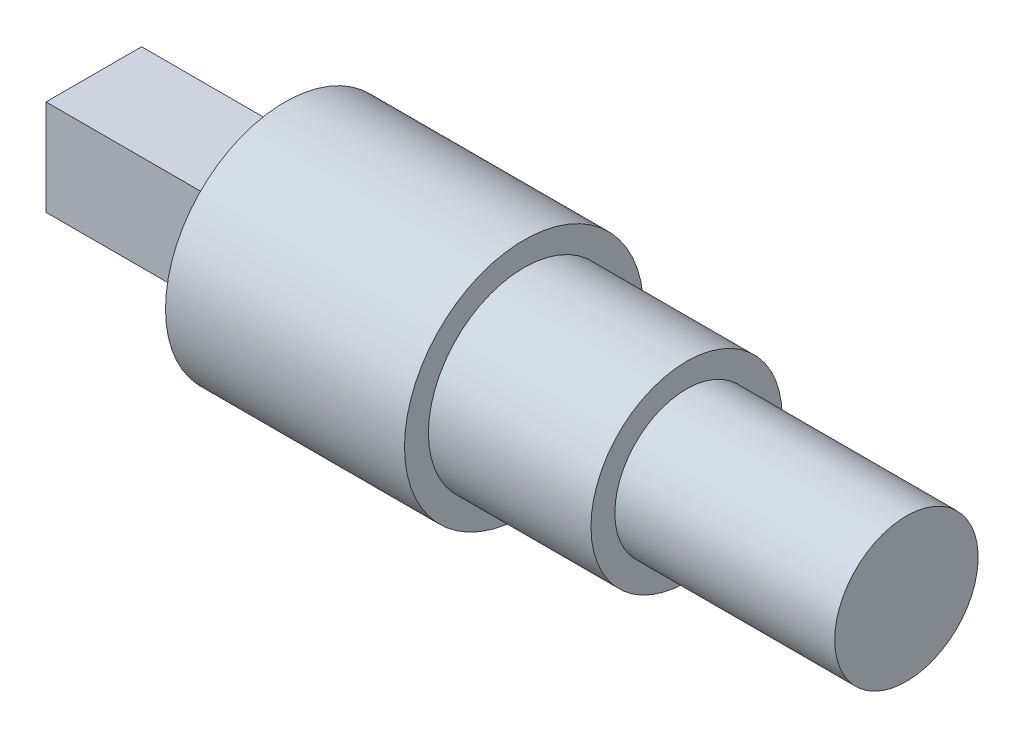
ISO-10303-21;
HEADER;
FILE_DESCRIPTION(('STEP AP214'),'2;1');
FILE_NAME('part.step','',(''),(''),'','','');
FILE_SCHEMA(('AUTOMOTIVE_DESIGN { 1 0 10303 214 1 1 1 1 }'));
ENDSEC;
DATA;
#1=APPLICATION_CONTEXT('core data for automotive mechanical design processes');
#2=APPLICATION_PROTOCOL_DEFINITION('international standard','automotive_design',2000,#1);
#3=PRODUCT_CONTEXT('',#1,'mechanical');
#4=PRODUCT('Part','Part','',(#3));
#5=PRODUCT_RELATED_PRODUCT_CATEGORY('part','',(#4));
#6=PRODUCT_DEFINITION_FORMATION('','',#4);
#7=PRODUCT_DEFINITION_CONTEXT('part definition',#1,'design');
#8=PRODUCT_DEFINITION('design','',#6,#7);
#9=PRODUCT_DEFINITION_SHAPE('','',#8);
#10=(LENGTH_UNIT() NAMED_UNIT(*) SI_UNIT(.MILLI.,.METRE.));
#11=(NAMED_UNIT(*) PLANE_ANGLE_UNIT() SI_UNIT($,.RADIAN.));
#12=(NAMED_UNIT(*) SI_UNIT($,.STERADIAN.) SOLID_ANGLE_UNIT());
#13=UNCERTAINTY_MEASURE_WITH_UNIT(LENGTH_MEASURE(1.E-05),#10,'distance_accuracy_value','');
#14=(GEOMETRIC_REPRESENTATION_CONTEXT(3) GLOBAL_UNCERTAINTY_ASSIGNED_CONTEXT((#13)) GLOBAL_UNIT_ASSIGNED_CONTEXT((#10,
#11,#12)) REPRESENTATION_CONTEXT('',''));
#15=CARTESIAN_POINT('',(0.,0.,0.));
#16=DIRECTION('',(0.,0.,1.));
#17=DIRECTION('',(1.,0.,0.));
#18=AXIS2_PLACEMENT_3D('',#15,#16,#17);
#19=CARTESIAN_POINT('',(20.,5.,0.));
#20=DIRECTION('',(1.,0.,0.));
#21=DIRECTION('',(0.,0.,-1.));
#22=AXIS2_PLACEMENT_3D('',#19,#20,#21);
#23=PLANE('',#22);
#24=DIRECTION('',(0.,0.,-1.));
#25=VECTOR('',#24,1.);
#26=CARTESIAN_POINT('',(20.,-5.,0.));
#27=LINE('',#26,#25);
#28=CARTESIAN_POINT('',(20.,-5.,5.));
#29=VERTEX_POINT('',#28);
#30=CARTESIAN_POINT('',(20.,-5.,-5.));
#31=VERTEX_POINT('',#30);
#32=EDGE_CURVE('E124',#29,#31,#27,.T.);
#33=ORIENTED_EDGE('',*,*,#32,.T.);
#34=DIRECTION('',(0.,1.,0.));
#35=VECTOR('',#34,1.);
#36=CARTESIAN_POINT('',(20.,5.,-5.));
#37=LINE('',#36,#35);
#38=CARTESIAN_POINT('',(20.,5.,-5.));
#39=VERTEX_POINT('',#38);
#40=EDGE_CURVE('E11',#31,#39,#37,.T.);
#41=ORIENTED_EDGE('',*,*,#40,.T.);
#42=DIRECTION('',(0.,0.,1.));
#43=VECTOR('',#42,1.);
#44=CARTESIAN_POINT('',(20.,5.,0.));
#45=LINE('',#44,#43);
#46=CARTESIAN_POINT('',(20.,5.,5.));
#47=VERTEX_POINT('',#46);
#48=EDGE_CURVE('E45',#39,#47,#45,.T.);
#49=ORIENTED_EDGE('',*,*,#48,.T.);
#50=DIRECTION('',(0.,-1.,0.));
#51=VECTOR('',#50,1.);
#52=CARTESIAN_POINT('',(20.,5.,5.));
#53=LINE('',#52,#51);
#54=EDGE_CURVE('E52',#47,#29,#53,.T.);
#55=ORIENTED_EDGE('',*,*,#54,.T.);
#56=EDGE_LOOP('',(#33,#41,#49,#55));
#57=FACE_BOUND('',#56,.T.);
#58=CARTESIAN_POINT('',(20.,0.,0.));
#59=DIRECTION('',(-1.,0.,0.));
#60=DIRECTION('',(0.,0.,1.));
#61=AXIS2_PLACEMENT_3D('',#58,#59,#60);
#62=CIRCLE('',#61,12.5);
#63=CARTESIAN_POINT('',(20.,0.,12.5));
#64=VERTEX_POINT('',#63);
#65=EDGE_CURVE('E120',#64,#64,#62,.T.);
#66=ORIENTED_EDGE('',*,*,#65,.T.);
#67=EDGE_LOOP('',(#66));
#68=FACE_BOUND('',#67,.T.);
#69=ADVANCED_FACE('F37',(#57,#68),#23,.F.);
#70=CARTESIAN_POINT('',(0.,0.,0.));
#71=DIRECTION('',(-1.,0.,0.));
#72=DIRECTION('',(0.,0.,1.));
#73=AXIS2_PLACEMENT_3D('',#70,#71,#72);
#74=CYLINDRICAL_SURFACE('',#73,12.5);
#75=ORIENTED_EDGE('',*,*,#65,.F.);
#76=EDGE_LOOP('',(#75));
#77=FACE_BOUND('',#76,.T.);
#78=CARTESIAN_POINT('',(45.,0.,0.));
#79=DIRECTION('',(-1.,0.,0.));
#80=DIRECTION('',(0.,0.,1.));
#81=AXIS2_PLACEMENT_3D('',#78,#79,#80);
#82=CIRCLE('',#81,12.5);
#83=CARTESIAN_POINT('',(45.,0.,12.5));
#84=VERTEX_POINT('',#83);
#85=EDGE_CURVE('E117',#84,#84,#82,.T.);
#86=ORIENTED_EDGE('',*,*,#85,.T.);
#87=EDGE_LOOP('',(#86));
#88=FACE_BOUND('',#87,.T.);
#89=ADVANCED_FACE('F127',(#77,#88),#74,.T.);
#90=CARTESIAN_POINT('',(45.,12.5,0.));
#91=DIRECTION('',(-1.,0.,0.));
#92=DIRECTION('',(0.,0.,1.));
#93=AXIS2_PLACEMENT_3D('',#90,#91,#92);
#94=PLANE('',#93);
#95=ORIENTED_EDGE('',*,*,#85,.F.);
#96=EDGE_LOOP('',(#95));
#97=FACE_BOUND('',#96,.T.);
#98=CARTESIAN_POINT('',(45.,0.,0.));
#99=DIRECTION('',(-1.,0.,0.));
#100=DIRECTION('',(0.,0.,1.));
#101=AXIS2_PLACEMENT_3D('',#98,#99,#100);
#102=CIRCLE('',#101,10.);
#103=CARTESIAN_POINT('',(45.,0.,10.));
#104=VERTEX_POINT('',#103);
#105=EDGE_CURVE('E114',#104,#104,#102,.T.);
#106=ORIENTED_EDGE('',*,*,#105,.T.);
#107=EDGE_LOOP('',(#106));
#108=FACE_BOUND('',#107,.T.);
#109=ADVANCED_FACE('F132',(#97,#108),#94,.F.);
#110=CARTESIAN_POINT('',(0.,0.,0.));
#111=DIRECTION('',(-1.,0.,0.));
#112=DIRECTION('',(0.,0.,1.));
#113=AXIS2_PLACEMENT_3D('',#110,#111,#112);
#114=CYLINDRICAL_SURFACE('',#113,10.);
#115=ORIENTED_EDGE('',*,*,#105,.F.);
#116=EDGE_LOOP('',(#115));
#117=FACE_BOUND('',#116,.T.);
#118=CARTESIAN_POINT('',(62.,0.,0.));
#119=DIRECTION('',(-1.,0.,0.));
#120=DIRECTION('',(0.,0.,1.));
#121=AXIS2_PLACEMENT_3D('',#118,#119,#120);
#122=CIRCLE('',#121,10.);
#123=CARTESIAN_POINT('',(62.,0.,10.));
#124=VERTEX_POINT('',#123);
#125=EDGE_CURVE('E111',#124,#124,#122,.T.);
#126=ORIENTED_EDGE('',*,*,#125,.T.);
#127=EDGE_LOOP('',(#126));
#128=FACE_BOUND('',#127,.T.);
#129=ADVANCED_FACE('F138',(#117,#128),#114,.T.);
#130=CARTESIAN_POINT('',(62.,10.,0.));
#131=DIRECTION('',(-1.,0.,0.));
#132=DIRECTION('',(0.,0.,1.));
#133=AXIS2_PLACEMENT_3D('',#130,#131,#132);
#134=PLANE('',#133);
#135=ORIENTED_EDGE('',*,*,#125,.F.);
#136=EDGE_LOOP('',(#135));
#137=FACE_BOUND('',#136,.T.);
#138=CARTESIAN_POINT('',(62.,0.,0.));
#139=DIRECTION('',(-1.,0.,0.));
#140=DIRECTION('',(0.,0.,1.));
#141=AXIS2_PLACEMENT_3D('',#138,#139,#140);
#142=CIRCLE('',#141,7.5);
#143=CARTESIAN_POINT('',(62.,0.,7.5));
#144=VERTEX_POINT('',#143);
#145=EDGE_CURVE('E108',#144,#144,#142,.T.);
#146=ORIENTED_EDGE('',*,*,#145,.T.);
#147=EDGE_LOOP('',(#146));
#148=FACE_BOUND('',#147,.T.);
#149=ADVANCED_FACE('F144',(#137,#148),#134,.F.);
#150=CARTESIAN_POINT('',(0.,0.,0.));
#151=DIRECTION('',(-1.,0.,0.));
#152=DIRECTION('',(0.,0.,1.));
#153=AXIS2_PLACEMENT_3D('',#150,#151,#152);
#154=CYLINDRICAL_SURFACE('',#153,7.5);
#155=ORIENTED_EDGE('',*,*,#145,.F.);
#156=EDGE_LOOP('',(#155));
#157=FACE_BOUND('',#156,.T.);
#158=CARTESIAN_POINT('',(85.,0.,0.));
#159=DIRECTION('',(-1.,0.,0.));
#160=DIRECTION('',(0.,0.,1.));
#161=AXIS2_PLACEMENT_3D('',#158,#159,#160);
#162=CIRCLE('',#161,7.5);
#163=CARTESIAN_POINT('',(85.,0.,7.5));
#164=VERTEX_POINT('',#163);
#165=EDGE_CURVE('E105',#164,#164,#162,.T.);
#166=ORIENTED_EDGE('',*,*,#165,.T.);
#167=EDGE_LOOP('',(#166));
#168=FACE_BOUND('',#167,.T.);
#169=ADVANCED_FACE('F150',(#157,#168),#154,.T.);
#170=CARTESIAN_POINT('',(85.,7.5,0.));
#171=DIRECTION('',(-1.,0.,0.));
#172=DIRECTION('',(0.,0.,1.));
#173=AXIS2_PLACEMENT_3D('',#170,#171,#172);
#174=PLANE('',#173);
#175=ORIENTED_EDGE('',*,*,#165,.F.);
#176=EDGE_LOOP('',(#175));
#177=FACE_BOUND('',#176,.T.);
#178=ADVANCED_FACE('F156',(#177),#174,.F.);
#179=CARTESIAN_POINT('',(34.142135623731,5.,-5.));
#180=DIRECTION('',(0.,1.,0.));
#181=DIRECTION('',(0.,0.,1.));
#182=AXIS2_PLACEMENT_3D('',#179,#180,#181);
#183=PLANE('',#182);
#184=DIRECTION('',(0.,0.,-1.));
#185=VECTOR('',#184,1.);
#186=CARTESIAN_POINT('',(0.,5.,-5.));
#187=LINE('',#186,#185);
#188=CARTESIAN_POINT('',(0.,5.,5.));
#189=VERTEX_POINT('',#188);
#190=CARTESIAN_POINT('',(0.,5.,-5.));
#191=VERTEX_POINT('',#190);
#192=EDGE_CURVE('E61',#189,#191,#187,.T.);
#193=ORIENTED_EDGE('',*,*,#192,.F.);
#194=DIRECTION('',(-1.,0.,0.));
#195=VECTOR('',#194,1.);
#196=CARTESIAN_POINT('',(34.142135623731,5.,5.));
#197=LINE('',#196,#195);
#198=EDGE_CURVE('E98',#47,#189,#197,.T.);
#199=ORIENTED_EDGE('',*,*,#198,.F.);
#200=ORIENTED_EDGE('',*,*,#48,.F.);
#201=DIRECTION('',(-1.,0.,0.));
#202=VECTOR('',#201,1.);
#203=CARTESIAN_POINT('',(34.142135623731,5.,-5.));
#204=LINE('',#203,#202);
#205=EDGE_CURVE('E94',#39,#191,#204,.T.);
#206=ORIENTED_EDGE('',*,*,#205,.T.);
#207=EDGE_LOOP('',(#193,#199,#200,#206));
#208=FACE_BOUND('',#207,.T.);
#209=ADVANCED_FACE('F161',(#208),#183,.T.);
#210=CARTESIAN_POINT('',(34.142135623731,-5.,-5.));
#211=DIRECTION('',(0.,0.,-1.));
#212=DIRECTION('',(-1.,0.,0.));
#213=AXIS2_PLACEMENT_3D('',#210,#211,#212);
#214=PLANE('',#213);
#215=DIRECTION('',(-1.,0.,0.));
#216=VECTOR('',#215,1.);
#217=CARTESIAN_POINT('',(34.142135623731,-5.,-5.));
#218=LINE('',#217,#216);
#219=CARTESIAN_POINT('',(0.,-5.,-5.));
#220=VERTEX_POINT('',#219);
#221=EDGE_CURVE('E92',#31,#220,#218,.T.);
#222=ORIENTED_EDGE('',*,*,#221,.T.);
#223=DIRECTION('',(0.,-1.,0.));
#224=VECTOR('',#223,1.);
#225=CARTESIAN_POINT('',(0.,-5.,-5.));
#226=LINE('',#225,#224);
#227=EDGE_CURVE('E80',#191,#220,#226,.T.);
#228=ORIENTED_EDGE('',*,*,#227,.F.);
#229=ORIENTED_EDGE('',*,*,#205,.F.);
#230=ORIENTED_EDGE('',*,*,#40,.F.);
#231=EDGE_LOOP('',(#222,#228,#229,#230));
#232=FACE_BOUND('',#231,.T.);
#233=ADVANCED_FACE('F96',(#232),#214,.T.);
#234=CARTESIAN_POINT('',(34.142135623731,-5.,-5.));
#235=DIRECTION('',(0.,-1.,0.));
#236=DIRECTION('',(0.,0.,-1.));
#237=AXIS2_PLACEMENT_3D('',#234,#235,#236);
#238=PLANE('',#237);
#239=DIRECTION('',(0.,0.,1.));
#240=VECTOR('',#239,1.);
#241=CARTESIAN_POINT('',(0.,-5.,-5.));
#242=LINE('',#241,#240);
#243=CARTESIAN_POINT('',(0.,-5.,5.));
#244=VERTEX_POINT('',#243);
#245=EDGE_CURVE('E82',#220,#244,#242,.T.);
#246=ORIENTED_EDGE('',*,*,#245,.F.);
#247=ORIENTED_EDGE('',*,*,#221,.F.);
#248=ORIENTED_EDGE('',*,*,#32,.F.);
#249=DIRECTION('',(-1.,0.,0.));
#250=VECTOR('',#249,1.);
#251=CARTESIAN_POINT('',(34.142135623731,-5.,5.));
#252=LINE('',#251,#250);
#253=EDGE_CURVE('E93',#29,#244,#252,.T.);
#254=ORIENTED_EDGE('',*,*,#253,.T.);
#255=EDGE_LOOP('',(#246,#247,#248,#254));
#256=FACE_BOUND('',#255,.T.);
#257=ADVANCED_FACE('F90',(#256),#238,.T.);
#258=CARTESIAN_POINT('',(34.142135623731,-5.,5.));
#259=DIRECTION('',(0.,0.,1.));
#260=DIRECTION('',(1.,0.,0.));
#261=AXIS2_PLACEMENT_3D('',#258,#259,#260);
#262=PLANE('',#261);
#263=DIRECTION('',(0.,1.,0.));
#264=VECTOR('',#263,1.);
#265=CARTESIAN_POINT('',(0.,-5.,5.));
#266=LINE('',#265,#264);
#267=EDGE_CURVE('E178',#244,#189,#266,.T.);
#268=ORIENTED_EDGE('',*,*,#267,.F.);
#269=ORIENTED_EDGE('',*,*,#253,.F.);
#270=ORIENTED_EDGE('',*,*,#54,.F.);
#271=ORIENTED_EDGE('',*,*,#198,.T.);
#272=EDGE_LOOP('',(#268,#269,#270,#271));
#273=FACE_BOUND('',#272,.T.);
#274=ADVANCED_FACE('F172',(#273),#262,.T.);
#275=CARTESIAN_POINT('',(0.,0.,0.));
#276=DIRECTION('',(1.,0.,0.));
#277=DIRECTION('',(0.,0.,-1.));
#278=AXIS2_PLACEMENT_3D('',#275,#276,#277);
#279=PLANE('',#278);
#280=ORIENTED_EDGE('',*,*,#245,.T.);
#281=ORIENTED_EDGE('',*,*,#267,.T.);
#282=ORIENTED_EDGE('',*,*,#192,.T.);
#283=ORIENTED_EDGE('',*,*,#227,.T.);
#284=EDGE_LOOP('',(#280,#281,#282,#283));
#285=FACE_BOUND('',#284,.T.);
#286=ADVANCED_FACE('F39',(#285),#279,.F.);
#287=CLOSED_SHELL('',(#69,#89,#109,#129,#149,#169,#178,#209,#233,#257,#274,#286));
#288=MANIFOLD_SOLID_BREP('B2',#287);
#289=ADVANCED_BREP_SHAPE_REPRESENTATION('',(#18,#288),#14);
#290=SHAPE_DEFINITION_REPRESENTATION(#9,#289);
ENDSEC;
END-ISO-10303-21;
